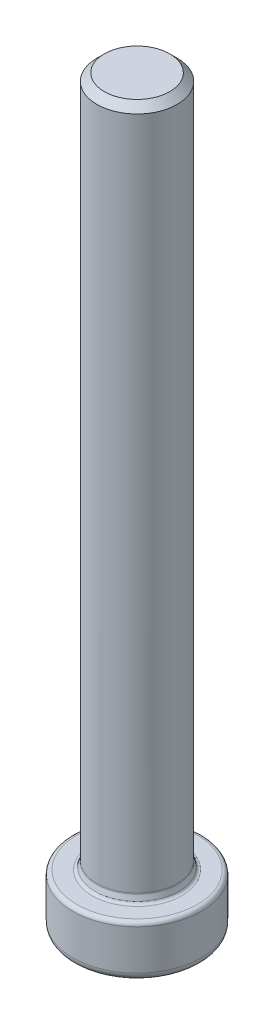
ISO-10303-21;
HEADER;
FILE_DESCRIPTION(('STEP AP214'),'2;1');
FILE_NAME('part.step','',(''),(''),'','','');
FILE_SCHEMA(('AUTOMOTIVE_DESIGN { 1 0 10303 214 1 1 1 1 }'));
ENDSEC;
DATA;
#1=APPLICATION_CONTEXT('core data for automotive mechanical design processes');
#2=APPLICATION_PROTOCOL_DEFINITION('international standard','automotive_design',2000,#1);
#3=PRODUCT_CONTEXT('',#1,'mechanical');
#4=PRODUCT('Part','Part','',(#3));
#5=PRODUCT_RELATED_PRODUCT_CATEGORY('part','',(#4));
#6=PRODUCT_DEFINITION_FORMATION('','',#4);
#7=PRODUCT_DEFINITION_CONTEXT('part definition',#1,'design');
#8=PRODUCT_DEFINITION('design','',#6,#7);
#9=PRODUCT_DEFINITION_SHAPE('','',#8);
#10=(LENGTH_UNIT() NAMED_UNIT(*) SI_UNIT(.MILLI.,.METRE.));
#11=(NAMED_UNIT(*) PLANE_ANGLE_UNIT() SI_UNIT($,.RADIAN.));
#12=(NAMED_UNIT(*) SI_UNIT($,.STERADIAN.) SOLID_ANGLE_UNIT());
#13=UNCERTAINTY_MEASURE_WITH_UNIT(LENGTH_MEASURE(1.E-05),#10,'distance_accuracy_value','');
#14=(GEOMETRIC_REPRESENTATION_CONTEXT(3) GLOBAL_UNCERTAINTY_ASSIGNED_CONTEXT((#13)) GLOBAL_UNIT_ASSIGNED_CONTEXT((#10,
#11,#12)) REPRESENTATION_CONTEXT('',''));
#15=CARTESIAN_POINT('',(0.,0.,0.));
#16=DIRECTION('',(0.,0.,1.));
#17=DIRECTION('',(1.,0.,0.));
#18=AXIS2_PLACEMENT_3D('',#15,#16,#17);
#19=CARTESIAN_POINT('',(-30.0499584026354,-27.5,11.));
#20=DIRECTION('',(0.,-1.,0.));
#21=DIRECTION('',(0.,0.,1.));
#22=AXIS2_PLACEMENT_3D('',#19,#20,#21);
#23=CYLINDRICAL_SURFACE('',#22,5.);
#24=CARTESIAN_POINT('',(-30.0499584026355,12.58,11.));
#25=DIRECTION('',(0.,-1.,0.));
#26=DIRECTION('',(0.,0.,1.));
#27=AXIS2_PLACEMENT_3D('',#24,#25,#26);
#28=CIRCLE('',#27,5.);
#29=CARTESIAN_POINT('',(-30.0499584026355,12.58,16.));
#30=VERTEX_POINT('',#29);
#31=CARTESIAN_POINT('',(-30.0499584026355,12.58,6.));
#32=VERTEX_POINT('',#31);
#33=EDGE_CURVE('E208',#30,#32,#28,.T.);
#34=ORIENTED_EDGE('',*,*,#33,.T.);
#35=DIRECTION('',(0.,-1.,0.));
#36=VECTOR('',#35,1.);
#37=CARTESIAN_POINT('',(-30.0499584026354,-27.5,6.));
#38=LINE('',#37,#36);
#39=CARTESIAN_POINT('',(-30.0499584026354,-71.48,6.));
#40=VERTEX_POINT('',#39);
#41=EDGE_CURVE('E11',#32,#40,#38,.T.);
#42=ORIENTED_EDGE('',*,*,#41,.T.);
#43=CARTESIAN_POINT('',(-30.0499584026354,-71.48,11.));
#44=DIRECTION('',(0.,1.,0.));
#45=DIRECTION('',(0.,0.,1.));
#46=AXIS2_PLACEMENT_3D('',#43,#44,#45);
#47=CIRCLE('',#46,5.);
#48=CARTESIAN_POINT('',(-25.0499584026354,-71.48,11.));
#49=VERTEX_POINT('',#48);
#50=EDGE_CURVE('E320',#40,#49,#47,.T.);
#51=ORIENTED_EDGE('',*,*,#50,.T.);
#52=CARTESIAN_POINT('',(-30.0499584026354,-71.48,11.));
#53=DIRECTION('',(0.,1.,0.));
#54=DIRECTION('',(0.,0.,1.));
#55=AXIS2_PLACEMENT_3D('',#52,#53,#54);
#56=CIRCLE('',#55,5.);
#57=EDGE_CURVE('E319',#49,#40,#56,.T.);
#58=ORIENTED_EDGE('',*,*,#57,.T.);
#59=ORIENTED_EDGE('',*,*,#41,.F.);
#60=CARTESIAN_POINT('',(-30.0499584026355,12.58,11.));
#61=DIRECTION('',(0.,-1.,0.));
#62=DIRECTION('',(0.,0.,1.));
#63=AXIS2_PLACEMENT_3D('',#60,#61,#62);
#64=CIRCLE('',#63,5.);
#65=EDGE_CURVE('E27',#32,#30,#64,.T.);
#66=ORIENTED_EDGE('',*,*,#65,.T.);
#67=EDGE_LOOP('',(#34,#42,#51,#58,#59,#66));
#68=FACE_BOUND('',#67,.T.);
#69=ADVANCED_FACE('F17',(#68),#23,.T.);
#70=CARTESIAN_POINT('',(-30.0499584026355,12.58,11.));
#71=DIRECTION('',(0.,-1.,0.));
#72=DIRECTION('',(0.,0.,-1.));
#73=AXIS2_PLACEMENT_3D('',#70,#71,#72);
#74=CONICAL_SURFACE('',#73,5.,0.78539816339745);
#75=ORIENTED_EDGE('',*,*,#33,.F.);
#76=DIRECTION('',(0.,0.707106781186546,-0.707106781186549));
#77=VECTOR('',#76,1.);
#78=CARTESIAN_POINT('',(-30.0499584026355,12.58,16.));
#79=LINE('',#78,#77);
#80=CARTESIAN_POINT('',(-30.0499584026355,13.5,15.08));
#81=VERTEX_POINT('',#80);
#82=EDGE_CURVE('E21',#30,#81,#79,.T.);
#83=ORIENTED_EDGE('',*,*,#82,.T.);
#84=CARTESIAN_POINT('',(-30.0499584026355,13.5,11.));
#85=DIRECTION('',(0.,-1.,0.));
#86=DIRECTION('',(0.,0.,1.));
#87=AXIS2_PLACEMENT_3D('',#84,#85,#86);
#88=CIRCLE('',#87,4.08);
#89=EDGE_CURVE('E185',#81,#81,#88,.T.);
#90=ORIENTED_EDGE('',*,*,#89,.T.);
#91=ORIENTED_EDGE('',*,*,#82,.F.);
#92=ORIENTED_EDGE('',*,*,#65,.F.);
#93=EDGE_LOOP('',(#75,#83,#90,#91,#92));
#94=FACE_BOUND('',#93,.T.);
#95=ADVANCED_FACE('F19',(#94),#74,.T.);
#96=CARTESIAN_POINT('',(-30.0499584026355,13.5,15.08));
#97=DIRECTION('',(0.,1.,0.));
#98=DIRECTION('',(1.,0.,0.));
#99=AXIS2_PLACEMENT_3D('',#96,#97,#98);
#100=PLANE('',#99);
#101=ORIENTED_EDGE('',*,*,#89,.F.);
#102=EDGE_LOOP('',(#101));
#103=FACE_BOUND('',#102,.T.);
#104=ADVANCED_FACE('F339',(#103),#100,.T.);
#105=CARTESIAN_POINT('',(-30.0499584026354,-72.1,11.));
#106=DIRECTION('',(0.,1.,0.));
#107=DIRECTION('',(-1.,0.,0.));
#108=AXIS2_PLACEMENT_3D('',#105,#106,#107);
#109=TOROIDAL_SURFACE('',#108,5.6,0.4);
#110=CARTESIAN_POINT('',(-30.0499584026354,-72.2228011119691,11.));
#111=DIRECTION('',(0.,-1.,0.));
#112=DIRECTION('',(-1.,0.,0.));
#113=AXIS2_PLACEMENT_3D('',#110,#111,#112);
#114=CIRCLE('',#113,5.21931655289578);
#115=CARTESIAN_POINT('',(-35.2692749555312,-72.2228011119691,11.));
#116=VERTEX_POINT('',#115);
#117=CARTESIAN_POINT('',(-24.8306418497397,-72.2228011119691,11.));
#118=VERTEX_POINT('',#117);
#119=EDGE_CURVE('E190',#116,#118,#114,.T.);
#120=ORIENTED_EDGE('',*,*,#119,.T.);
#121=CARTESIAN_POINT('',(-24.4499584026354,-72.1,11.));
#122=DIRECTION('',(0.,0.,1.));
#123=DIRECTION('',(1.,0.,0.));
#124=AXIS2_PLACEMENT_3D('',#121,#122,#123);
#125=CIRCLE('',#124,0.4);
#126=CARTESIAN_POINT('',(-24.4499584026354,-72.5,11.));
#127=VERTEX_POINT('',#126);
#128=EDGE_CURVE('E176',#118,#127,#125,.T.);
#129=ORIENTED_EDGE('',*,*,#128,.T.);
#130=CARTESIAN_POINT('',(-30.0499584026354,-72.5,11.));
#131=DIRECTION('',(0.,1.,0.));
#132=DIRECTION('',(0.,0.,-1.));
#133=AXIS2_PLACEMENT_3D('',#130,#131,#132);
#134=CIRCLE('',#133,5.6);
#135=EDGE_CURVE('E183',#127,#127,#134,.T.);
#136=ORIENTED_EDGE('',*,*,#135,.T.);
#137=ORIENTED_EDGE('',*,*,#128,.F.);
#138=CARTESIAN_POINT('',(-30.0499584026354,-72.2228011119691,11.));
#139=DIRECTION('',(0.,-1.,0.));
#140=DIRECTION('',(-1.,0.,0.));
#141=AXIS2_PLACEMENT_3D('',#138,#139,#140);
#142=CIRCLE('',#141,5.21931655289578);
#143=EDGE_CURVE('E180',#118,#116,#142,.T.);
#144=ORIENTED_EDGE('',*,*,#143,.T.);
#145=EDGE_LOOP('',(#120,#129,#136,#137,#144));
#146=FACE_BOUND('',#145,.T.);
#147=ADVANCED_FACE('F179',(#146),#109,.F.);
#148=CARTESIAN_POINT('',(-30.0499584026354,-71.6028011119691,11.));
#149=DIRECTION('',(0.,-1.,0.));
#150=DIRECTION('',(1.,0.,0.));
#151=AXIS2_PLACEMENT_3D('',#148,#149,#150);
#152=CONICAL_SURFACE('',#151,5.01931655289578,0.312042121562536);
#153=ORIENTED_EDGE('',*,*,#119,.F.);
#154=DIRECTION('',(0.307002779922761,0.95170861776055,0.));
#155=VECTOR('',#154,1.);
#156=CARTESIAN_POINT('',(-35.0692749555312,-71.6028011119691,11.));
#157=LINE('',#156,#155);
#158=CARTESIAN_POINT('',(-35.0692749555312,-71.6028011119691,11.));
#159=VERTEX_POINT('',#158);
#160=EDGE_CURVE('E192',#116,#159,#157,.T.);
#161=ORIENTED_EDGE('',*,*,#160,.T.);
#162=CARTESIAN_POINT('',(-30.0499584026354,-71.6028011119691,11.));
#163=DIRECTION('',(0.,-1.,0.));
#164=DIRECTION('',(-1.,0.,0.));
#165=AXIS2_PLACEMENT_3D('',#162,#163,#164);
#166=CIRCLE('',#165,5.01931655289578);
#167=CARTESIAN_POINT('',(-25.0306418497397,-71.6028011119691,11.));
#168=VERTEX_POINT('',#167);
#169=EDGE_CURVE('E202',#159,#168,#166,.T.);
#170=ORIENTED_EDGE('',*,*,#169,.T.);
#171=CARTESIAN_POINT('',(-30.0499584026354,-71.6028011119691,11.));
#172=DIRECTION('',(0.,-1.,0.));
#173=DIRECTION('',(-1.,0.,0.));
#174=AXIS2_PLACEMENT_3D('',#171,#172,#173);
#175=CIRCLE('',#174,5.01931655289578);
#176=EDGE_CURVE('E196',#168,#159,#175,.T.);
#177=ORIENTED_EDGE('',*,*,#176,.T.);
#178=ORIENTED_EDGE('',*,*,#160,.F.);
#179=ORIENTED_EDGE('',*,*,#143,.F.);
#180=EDGE_LOOP('',(#153,#161,#170,#177,#178,#179));
#181=FACE_BOUND('',#180,.T.);
#182=ADVANCED_FACE('F189',(#181),#152,.T.);
#183=CARTESIAN_POINT('',(-30.0499584026354,-71.48,11.));
#184=DIRECTION('',(0.,1.,0.));
#185=DIRECTION('',(-1.,0.,0.));
#186=AXIS2_PLACEMENT_3D('',#183,#184,#185);
#187=TOROIDAL_SURFACE('',#186,5.4,0.4);
#188=ORIENTED_EDGE('',*,*,#50,.F.);
#189=ORIENTED_EDGE('',*,*,#57,.F.);
#190=CARTESIAN_POINT('',(-24.6499584026354,-71.48,11.));
#191=DIRECTION('',(0.,0.,1.));
#192=DIRECTION('',(1.,0.,0.));
#193=AXIS2_PLACEMENT_3D('',#190,#191,#192);
#194=CIRCLE('',#193,0.4);
#195=EDGE_CURVE('E315',#49,#168,#194,.T.);
#196=ORIENTED_EDGE('',*,*,#195,.T.);
#197=ORIENTED_EDGE('',*,*,#169,.F.);
#198=ORIENTED_EDGE('',*,*,#176,.F.);
#199=ORIENTED_EDGE('',*,*,#195,.F.);
#200=EDGE_LOOP('',(#188,#189,#196,#197,#198,#199));
#201=FACE_BOUND('',#200,.T.);
#202=ADVANCED_FACE('F332',(#201),#187,.F.);
#203=CARTESIAN_POINT('',(-30.0499584026354,-75.5,11.));
#204=DIRECTION('',(0.,-1.,0.));
#205=DIRECTION('',(0.,0.,-1.));
#206=AXIS2_PLACEMENT_3D('',#203,#204,#205);
#207=CONICAL_SURFACE('',#206,4.,1.0471975511966);
#208=CARTESIAN_POINT('',(-30.0499584026354,-74.6339745962156,11.));
#209=DIRECTION('',(0.,-1.,0.));
#210=DIRECTION('',(0.,0.,1.));
#211=AXIS2_PLACEMENT_3D('',#208,#209,#210);
#212=CIRCLE('',#211,2.5);
#213=CARTESIAN_POINT('',(-30.0499584026354,-74.6339745962156,13.5));
#214=VERTEX_POINT('',#213);
#215=CARTESIAN_POINT('',(-30.0499584026354,-74.6339745962156,8.5));
#216=VERTEX_POINT('',#215);
#217=EDGE_CURVE('E303',#214,#216,#212,.T.);
#218=ORIENTED_EDGE('',*,*,#217,.F.);
#219=DIRECTION('',(0.,-0.5,0.86602540378444));
#220=VECTOR('',#219,1.);
#221=CARTESIAN_POINT('',(-30.0499584026354,-75.5,15.));
#222=LINE('',#221,#220);
#223=CARTESIAN_POINT('',(-30.0499584026354,-75.5,15.));
#224=VERTEX_POINT('',#223);
#225=EDGE_CURVE('E314',#214,#224,#222,.T.);
#226=ORIENTED_EDGE('',*,*,#225,.T.);
#227=CARTESIAN_POINT('',(-30.0499584026354,-75.5,11.));
#228=DIRECTION('',(0.,-1.,0.));
#229=DIRECTION('',(-1.,0.,0.));
#230=AXIS2_PLACEMENT_3D('',#227,#228,#229);
#231=CIRCLE('',#230,4.);
#232=CARTESIAN_POINT('',(-33.5140600177732,-75.5,13.));
#233=VERTEX_POINT('',#232);
#234=EDGE_CURVE('E278',#224,#233,#231,.T.);
#235=ORIENTED_EDGE('',*,*,#234,.T.);
#236=CARTESIAN_POINT('',(-30.0499584026354,-75.5,11.));
#237=DIRECTION('',(0.,-1.,0.));
#238=DIRECTION('',(-1.,0.,0.));
#239=AXIS2_PLACEMENT_3D('',#236,#237,#238);
#240=CIRCLE('',#239,4.);
#241=CARTESIAN_POINT('',(-33.5140600177732,-75.5,9.));
#242=VERTEX_POINT('',#241);
#243=EDGE_CURVE('E282',#233,#242,#240,.T.);
#244=ORIENTED_EDGE('',*,*,#243,.T.);
#245=CARTESIAN_POINT('',(-30.0499584026354,-75.5,11.));
#246=DIRECTION('',(0.,-1.,0.));
#247=DIRECTION('',(-1.,0.,0.));
#248=AXIS2_PLACEMENT_3D('',#245,#246,#247);
#249=CIRCLE('',#248,4.);
#250=CARTESIAN_POINT('',(-30.0499584026354,-75.5,7.));
#251=VERTEX_POINT('',#250);
#252=EDGE_CURVE('E286',#242,#251,#249,.T.);
#253=ORIENTED_EDGE('',*,*,#252,.T.);
#254=CARTESIAN_POINT('',(-30.0499584026354,-75.5,11.));
#255=DIRECTION('',(0.,-1.,0.));
#256=DIRECTION('',(-1.,0.,0.));
#257=AXIS2_PLACEMENT_3D('',#254,#255,#256);
#258=CIRCLE('',#257,4.);
#259=CARTESIAN_POINT('',(-26.5858567874977,-75.5,9.));
#260=VERTEX_POINT('',#259);
#261=EDGE_CURVE('E296',#251,#260,#258,.T.);
#262=ORIENTED_EDGE('',*,*,#261,.T.);
#263=CARTESIAN_POINT('',(-30.0499584026354,-75.5,11.));
#264=DIRECTION('',(0.,-1.,0.));
#265=DIRECTION('',(-1.,0.,0.));
#266=AXIS2_PLACEMENT_3D('',#263,#264,#265);
#267=CIRCLE('',#266,4.);
#268=CARTESIAN_POINT('',(-26.5858567874977,-75.5,13.));
#269=VERTEX_POINT('',#268);
#270=EDGE_CURVE('E292',#260,#269,#267,.T.);
#271=ORIENTED_EDGE('',*,*,#270,.T.);
#272=CARTESIAN_POINT('',(-30.0499584026354,-75.5,11.));
#273=DIRECTION('',(0.,-1.,0.));
#274=DIRECTION('',(-1.,0.,0.));
#275=AXIS2_PLACEMENT_3D('',#272,#273,#274);
#276=CIRCLE('',#275,4.);
#277=EDGE_CURVE('E287',#269,#224,#276,.T.);
#278=ORIENTED_EDGE('',*,*,#277,.T.);
#279=ORIENTED_EDGE('',*,*,#225,.F.);
#280=CARTESIAN_POINT('',(-30.0499584026354,-74.6339745962156,11.));
#281=DIRECTION('',(0.,-1.,0.));
#282=DIRECTION('',(0.,0.,1.));
#283=AXIS2_PLACEMENT_3D('',#280,#281,#282);
#284=CIRCLE('',#283,2.5);
#285=EDGE_CURVE('E307',#216,#214,#284,.T.);
#286=ORIENTED_EDGE('',*,*,#285,.F.);
#287=EDGE_LOOP('',(#218,#226,#235,#244,#253,#262,#271,#278,#279,#286));
#288=FACE_BOUND('',#287,.T.);
#289=ADVANCED_FACE('F372',(#288),#207,.F.);
#290=CARTESIAN_POINT('',(-30.0499584026354,-71.5,11.));
#291=DIRECTION('',(0.,-1.,0.));
#292=DIRECTION('',(0.,0.,1.));
#293=AXIS2_PLACEMENT_3D('',#290,#291,#292);
#294=CYLINDRICAL_SURFACE('',#293,2.5);
#295=ORIENTED_EDGE('',*,*,#217,.T.);
#296=DIRECTION('',(0.,1.,0.));
#297=VECTOR('',#296,1.);
#298=CARTESIAN_POINT('',(-30.0499584026354,-71.5,8.5));
#299=LINE('',#298,#297);
#300=CARTESIAN_POINT('',(-30.0499584026354,-71.5,8.5));
#301=VERTEX_POINT('',#300);
#302=EDGE_CURVE('E304',#216,#301,#299,.T.);
#303=ORIENTED_EDGE('',*,*,#302,.T.);
#304=CARTESIAN_POINT('',(-30.0499584026354,-71.5,11.));
#305=DIRECTION('',(0.,-1.,0.));
#306=DIRECTION('',(0.,0.,1.));
#307=AXIS2_PLACEMENT_3D('',#304,#305,#306);
#308=CIRCLE('',#307,2.5);
#309=EDGE_CURVE('E291',#301,#301,#308,.T.);
#310=ORIENTED_EDGE('',*,*,#309,.F.);
#311=ORIENTED_EDGE('',*,*,#302,.F.);
#312=ORIENTED_EDGE('',*,*,#285,.T.);
#313=EDGE_LOOP('',(#295,#303,#310,#311,#312));
#314=FACE_BOUND('',#313,.T.);
#315=ADVANCED_FACE('F368',(#314),#294,.F.);
#316=CARTESIAN_POINT('',(-32.5499584026354,-71.5,11.));
#317=DIRECTION('',(0.,1.,0.));
#318=DIRECTION('',(1.,0.,0.));
#319=AXIS2_PLACEMENT_3D('',#316,#317,#318);
#320=PLANE('',#319);
#321=ORIENTED_EDGE('',*,*,#309,.T.);
#322=EDGE_LOOP('',(#321));
#323=FACE_BOUND('',#322,.T.);
#324=ADVANCED_FACE('F371',(#323),#320,.F.);
#325=CARTESIAN_POINT('',(-30.0499584026354,-75.5,11.));
#326=DIRECTION('',(0.,-1.,0.));
#327=DIRECTION('',(0.,0.,-1.));
#328=AXIS2_PLACEMENT_3D('',#325,#326,#327);
#329=PLANE('',#328);
#330=ORIENTED_EDGE('',*,*,#277,.F.);
#331=DIRECTION('',(-0.5,0.,0.866025403784439));
#332=VECTOR('',#331,1.);
#333=CARTESIAN_POINT('',(-25.4311562491184,-75.5,11.));
#334=LINE('',#333,#332);
#335=CARTESIAN_POINT('',(-27.7405573258769,-75.5,15.));
#336=VERTEX_POINT('',#335);
#337=EDGE_CURVE('E247',#269,#336,#334,.T.);
#338=ORIENTED_EDGE('',*,*,#337,.T.);
#339=DIRECTION('',(-1.,0.,0.));
#340=VECTOR('',#339,1.);
#341=CARTESIAN_POINT('',(-27.7405573258769,-75.5,15.));
#342=LINE('',#341,#340);
#343=EDGE_CURVE('E266',#336,#224,#342,.T.);
#344=ORIENTED_EDGE('',*,*,#343,.T.);
#345=EDGE_LOOP('',(#330,#338,#344));
#346=FACE_BOUND('',#345,.T.);
#347=ADVANCED_FACE('F392',(#346),#329,.T.);
#348=CARTESIAN_POINT('',(-30.0499584026354,-75.5,11.));
#349=DIRECTION('',(0.,-1.,0.));
#350=DIRECTION('',(0.,0.,-1.));
#351=AXIS2_PLACEMENT_3D('',#348,#349,#350);
#352=PLANE('',#351);
#353=ORIENTED_EDGE('',*,*,#270,.F.);
#354=DIRECTION('',(0.5,0.,0.866025403784439));
#355=VECTOR('',#354,1.);
#356=CARTESIAN_POINT('',(-27.7405573258769,-75.5,7.));
#357=LINE('',#356,#355);
#358=CARTESIAN_POINT('',(-25.4311562491184,-75.5,11.));
#359=VERTEX_POINT('',#358);
#360=EDGE_CURVE('E239',#260,#359,#357,.T.);
#361=ORIENTED_EDGE('',*,*,#360,.T.);
#362=DIRECTION('',(-0.5,0.,0.866025403784439));
#363=VECTOR('',#362,1.);
#364=CARTESIAN_POINT('',(-25.4311562491184,-75.5,11.));
#365=LINE('',#364,#363);
#366=EDGE_CURVE('E251',#359,#269,#365,.T.);
#367=ORIENTED_EDGE('',*,*,#366,.T.);
#368=EDGE_LOOP('',(#353,#361,#367));
#369=FACE_BOUND('',#368,.T.);
#370=ADVANCED_FACE('F388',(#369),#352,.T.);
#371=CARTESIAN_POINT('',(-30.0499584026354,-75.5,11.));
#372=DIRECTION('',(0.,-1.,0.));
#373=DIRECTION('',(0.,0.,-1.));
#374=AXIS2_PLACEMENT_3D('',#371,#372,#373);
#375=PLANE('',#374);
#376=ORIENTED_EDGE('',*,*,#261,.F.);
#377=DIRECTION('',(1.,0.,0.));
#378=VECTOR('',#377,1.);
#379=CARTESIAN_POINT('',(-32.3593594793939,-75.5,7.));
#380=LINE('',#379,#378);
#381=CARTESIAN_POINT('',(-27.7405573258769,-75.5,7.));
#382=VERTEX_POINT('',#381);
#383=EDGE_CURVE('E231',#251,#382,#380,.T.);
#384=ORIENTED_EDGE('',*,*,#383,.T.);
#385=DIRECTION('',(0.5,0.,0.866025403784439));
#386=VECTOR('',#385,1.);
#387=CARTESIAN_POINT('',(-27.7405573258769,-75.5,7.));
#388=LINE('',#387,#386);
#389=EDGE_CURVE('E243',#382,#260,#388,.T.);
#390=ORIENTED_EDGE('',*,*,#389,.T.);
#391=EDGE_LOOP('',(#376,#384,#390));
#392=FACE_BOUND('',#391,.T.);
#393=ADVANCED_FACE('F384',(#392),#375,.T.);
#394=CARTESIAN_POINT('',(-30.0499584026354,-75.5,11.));
#395=DIRECTION('',(0.,-1.,0.));
#396=DIRECTION('',(0.,0.,-1.));
#397=AXIS2_PLACEMENT_3D('',#394,#395,#396);
#398=PLANE('',#397);
#399=ORIENTED_EDGE('',*,*,#252,.F.);
#400=DIRECTION('',(0.5,0.,-0.866025403784439));
#401=VECTOR('',#400,1.);
#402=CARTESIAN_POINT('',(-34.6687605561524,-75.5,11.));
#403=LINE('',#402,#401);
#404=CARTESIAN_POINT('',(-32.3593594793939,-75.5,7.));
#405=VERTEX_POINT('',#404);
#406=EDGE_CURVE('E256',#242,#405,#403,.T.);
#407=ORIENTED_EDGE('',*,*,#406,.T.);
#408=DIRECTION('',(1.,0.,0.));
#409=VECTOR('',#408,1.);
#410=CARTESIAN_POINT('',(-32.3593594793939,-75.5,7.));
#411=LINE('',#410,#409);
#412=EDGE_CURVE('E235',#405,#251,#411,.T.);
#413=ORIENTED_EDGE('',*,*,#412,.T.);
#414=EDGE_LOOP('',(#399,#407,#413));
#415=FACE_BOUND('',#414,.T.);
#416=ADVANCED_FACE('F380',(#415),#398,.T.);
#417=CARTESIAN_POINT('',(-30.0499584026354,-75.5,11.));
#418=DIRECTION('',(0.,-1.,0.));
#419=DIRECTION('',(0.,0.,-1.));
#420=AXIS2_PLACEMENT_3D('',#417,#418,#419);
#421=PLANE('',#420);
#422=DIRECTION('',(-0.5,0.,-0.866025403784439));
#423=VECTOR('',#422,1.);
#424=CARTESIAN_POINT('',(-32.3593594793939,-75.5,15.));
#425=LINE('',#424,#423);
#426=CARTESIAN_POINT('',(-34.6687605561524,-75.5,11.));
#427=VERTEX_POINT('',#426);
#428=EDGE_CURVE('E271',#233,#427,#425,.T.);
#429=ORIENTED_EDGE('',*,*,#428,.T.);
#430=DIRECTION('',(0.5,0.,-0.866025403784439));
#431=VECTOR('',#430,1.);
#432=CARTESIAN_POINT('',(-34.6687605561524,-75.5,11.));
#433=LINE('',#432,#431);
#434=EDGE_CURVE('E259',#427,#242,#433,.T.);
#435=ORIENTED_EDGE('',*,*,#434,.T.);
#436=ORIENTED_EDGE('',*,*,#243,.F.);
#437=EDGE_LOOP('',(#429,#435,#436));
#438=FACE_BOUND('',#437,.T.);
#439=ADVANCED_FACE('F376',(#438),#421,.T.);
#440=CARTESIAN_POINT('',(-30.0499584026354,-75.5,11.));
#441=DIRECTION('',(0.,-1.,0.));
#442=DIRECTION('',(0.,0.,-1.));
#443=AXIS2_PLACEMENT_3D('',#440,#441,#442);
#444=PLANE('',#443);
#445=ORIENTED_EDGE('',*,*,#234,.F.);
#446=DIRECTION('',(-1.,0.,0.));
#447=VECTOR('',#446,1.);
#448=CARTESIAN_POINT('',(-27.7405573258769,-75.5,15.));
#449=LINE('',#448,#447);
#450=CARTESIAN_POINT('',(-32.3593594793939,-75.5,15.));
#451=VERTEX_POINT('',#450);
#452=EDGE_CURVE('E263',#224,#451,#449,.T.);
#453=ORIENTED_EDGE('',*,*,#452,.T.);
#454=DIRECTION('',(-0.5,0.,-0.866025403784439));
#455=VECTOR('',#454,1.);
#456=CARTESIAN_POINT('',(-32.3593594793939,-75.5,15.));
#457=LINE('',#456,#455);
#458=EDGE_CURVE('E260',#451,#233,#457,.T.);
#459=ORIENTED_EDGE('',*,*,#458,.T.);
#460=EDGE_LOOP('',(#445,#453,#459));
#461=FACE_BOUND('',#460,.T.);
#462=ADVANCED_FACE('F366',(#461),#444,.T.);
#463=CARTESIAN_POINT('',(-34.6687605561524,-75.5,11.));
#464=DIRECTION('',(-0.866025403784439,0.,-0.5));
#465=DIRECTION('',(-0.5,0.,0.866025403784439));
#466=AXIS2_PLACEMENT_3D('',#463,#464,#465);
#467=PLANE('',#466);
#468=DIRECTION('',(0.,-1.,0.));
#469=VECTOR('',#468,1.);
#470=CARTESIAN_POINT('',(-34.6687605561524,-75.5,11.));
#471=LINE('',#470,#469);
#472=CARTESIAN_POINT('',(-34.6687605561524,-79.,11.));
#473=VERTEX_POINT('',#472);
#474=EDGE_CURVE('E268',#427,#473,#471,.T.);
#475=ORIENTED_EDGE('',*,*,#474,.T.);
#476=CARTESIAN_POINT('',(-34.6687605561524,-79.,11.));
#477=CARTESIAN_POINT('',(-33.5140600177732,-77.8452994616206,9.00000000000001));
#478=CARTESIAN_POINT('',(-32.3593594793939,-79.,7.));
#479=(BOUNDED_CURVE() B_SPLINE_CURVE(2,(#476,#477,#478),.UNSPECIFIED.,.F.,
.F.) B_SPLINE_CURVE_WITH_KNOTS((3,3),(-0.705094379751374,-0.147934530722328),
.UNSPECIFIED.) CURVE() GEOMETRIC_REPRESENTATION_ITEM() RATIONAL_B_SPLINE_CURVE((1.11602540378444,
1.28867513459481,1.11602540378444)) REPRESENTATION_ITEM(''));
#480=CARTESIAN_POINT('',(-32.3593594793939,-79.,7.));
#481=VERTEX_POINT('',#480);
#482=EDGE_CURVE('E722',#473,#481,#479,.T.);
#483=ORIENTED_EDGE('',*,*,#482,.T.);
#484=DIRECTION('',(0.,-1.,0.));
#485=VECTOR('',#484,1.);
#486=CARTESIAN_POINT('',(-32.3593594793939,-75.5,7.));
#487=LINE('',#486,#485);
#488=EDGE_CURVE('E227',#405,#481,#487,.T.);
#489=ORIENTED_EDGE('',*,*,#488,.F.);
#490=ORIENTED_EDGE('',*,*,#406,.F.);
#491=ORIENTED_EDGE('',*,*,#434,.F.);
#492=EDGE_LOOP('',(#475,#483,#489,#490,#491));
#493=FACE_BOUND('',#492,.T.);
#494=ADVANCED_FACE('F362',(#493),#467,.F.);
#495=CARTESIAN_POINT('',(-32.3593594793939,-75.5,15.));
#496=DIRECTION('',(-0.866025403784439,0.,0.5));
#497=DIRECTION('',(0.,1.,0.));
#498=AXIS2_PLACEMENT_3D('',#495,#496,#497);
#499=PLANE('',#498);
#500=DIRECTION('',(0.,-1.,0.));
#501=VECTOR('',#500,1.);
#502=CARTESIAN_POINT('',(-32.3593594793939,-75.5,15.));
#503=LINE('',#502,#501);
#504=CARTESIAN_POINT('',(-32.3593594793939,-79.,15.));
#505=VERTEX_POINT('',#504);
#506=EDGE_CURVE('E255',#451,#505,#503,.T.);
#507=ORIENTED_EDGE('',*,*,#506,.T.);
#508=CARTESIAN_POINT('',(-32.3593594793939,-79.,15.));
#509=CARTESIAN_POINT('',(-33.5140600177732,-77.8452994616206,13.));
#510=CARTESIAN_POINT('',(-34.6687605561524,-79.,11.));
#511=(BOUNDED_CURVE() B_SPLINE_CURVE(2,(#508,#509,#510),.UNSPECIFIED.,.F.,
.F.) B_SPLINE_CURVE_WITH_KNOTS((3,3),(-0.705094379751375,-0.147934530722328),
.UNSPECIFIED.) CURVE() GEOMETRIC_REPRESENTATION_ITEM() RATIONAL_B_SPLINE_CURVE((1.11602540378444,
1.28867513459482,1.11602540378444)) REPRESENTATION_ITEM(''));
#512=EDGE_CURVE('E709',#505,#473,#511,.T.);
#513=ORIENTED_EDGE('',*,*,#512,.T.);
#514=ORIENTED_EDGE('',*,*,#474,.F.);
#515=ORIENTED_EDGE('',*,*,#428,.F.);
#516=ORIENTED_EDGE('',*,*,#458,.F.);
#517=EDGE_LOOP('',(#507,#513,#514,#515,#516));
#518=FACE_BOUND('',#517,.T.);
#519=ADVANCED_FACE('F358',(#518),#499,.F.);
#520=CARTESIAN_POINT('',(-27.7405573258769,-75.5,15.));
#521=DIRECTION('',(0.,0.,1.));
#522=DIRECTION('',(1.,0.,0.));
#523=AXIS2_PLACEMENT_3D('',#520,#521,#522);
#524=PLANE('',#523);
#525=DIRECTION('',(0.,-1.,0.));
#526=VECTOR('',#525,1.);
#527=CARTESIAN_POINT('',(-27.7405573258769,-75.5,15.));
#528=LINE('',#527,#526);
#529=CARTESIAN_POINT('',(-27.7405573258769,-79.,15.));
#530=VERTEX_POINT('',#529);
#531=EDGE_CURVE('E244',#336,#530,#528,.T.);
#532=ORIENTED_EDGE('',*,*,#531,.T.);
#533=CARTESIAN_POINT('',(-27.7405573258769,-79.,15.));
#534=CARTESIAN_POINT('',(-30.0499584026354,-77.8452994616206,15.));
#535=CARTESIAN_POINT('',(-32.3593594793939,-79.,15.));
#536=(BOUNDED_CURVE() B_SPLINE_CURVE(2,(#533,#534,#535),.UNSPECIFIED.,.F.,
.F.) B_SPLINE_CURVE_WITH_KNOTS((3,3),(-0.705094379751374,-0.147934530722328),
.UNSPECIFIED.) CURVE() GEOMETRIC_REPRESENTATION_ITEM() RATIONAL_B_SPLINE_CURVE((1.11602540378444,
1.28867513459482,1.11602540378444)) REPRESENTATION_ITEM(''));
#537=EDGE_CURVE('E699',#530,#505,#536,.T.);
#538=ORIENTED_EDGE('',*,*,#537,.T.);
#539=ORIENTED_EDGE('',*,*,#506,.F.);
#540=ORIENTED_EDGE('',*,*,#452,.F.);
#541=ORIENTED_EDGE('',*,*,#343,.F.);
#542=EDGE_LOOP('',(#532,#538,#539,#540,#541));
#543=FACE_BOUND('',#542,.T.);
#544=ADVANCED_FACE('F361',(#543),#524,.F.);
#545=CARTESIAN_POINT('',(-25.4311562491184,-75.5,11.));
#546=DIRECTION('',(0.866025403784439,0.,0.5));
#547=DIRECTION('',(0.,-1.,0.));
#548=AXIS2_PLACEMENT_3D('',#545,#546,#547);
#549=PLANE('',#548);
#550=DIRECTION('',(0.,-1.,0.));
#551=VECTOR('',#550,1.);
#552=CARTESIAN_POINT('',(-25.4311562491184,-75.5,11.));
#553=LINE('',#552,#551);
#554=CARTESIAN_POINT('',(-25.4311562491184,-79.,11.));
#555=VERTEX_POINT('',#554);
#556=EDGE_CURVE('E236',#359,#555,#553,.T.);
#557=ORIENTED_EDGE('',*,*,#556,.T.);
#558=CARTESIAN_POINT('',(-25.4311562491184,-79.,11.));
#559=CARTESIAN_POINT('',(-26.5858567874977,-77.8452994616206,13.));
#560=CARTESIAN_POINT('',(-27.7405573258769,-79.,15.));
#561=(BOUNDED_CURVE() B_SPLINE_CURVE(2,(#558,#559,#560),.UNSPECIFIED.,.F.,
.F.) B_SPLINE_CURVE_WITH_KNOTS((3,3),(-0.705094379751373,-0.147934530722327),
.UNSPECIFIED.) CURVE() GEOMETRIC_REPRESENTATION_ITEM() RATIONAL_B_SPLINE_CURVE((1.11602540378444,
1.28867513459481,1.11602540378444)) REPRESENTATION_ITEM(''));
#562=EDGE_CURVE('E671',#555,#530,#561,.T.);
#563=ORIENTED_EDGE('',*,*,#562,.T.);
#564=ORIENTED_EDGE('',*,*,#531,.F.);
#565=ORIENTED_EDGE('',*,*,#337,.F.);
#566=ORIENTED_EDGE('',*,*,#366,.F.);
#567=EDGE_LOOP('',(#557,#563,#564,#565,#566));
#568=FACE_BOUND('',#567,.T.);
#569=ADVANCED_FACE('F356',(#568),#549,.F.);
#570=CARTESIAN_POINT('',(-27.7405573258769,-75.5,7.));
#571=DIRECTION('',(0.866025403784439,0.,-0.5));
#572=DIRECTION('',(0.,-1.,0.));
#573=AXIS2_PLACEMENT_3D('',#570,#571,#572);
#574=PLANE('',#573);
#575=DIRECTION('',(0.,-1.,0.));
#576=VECTOR('',#575,1.);
#577=CARTESIAN_POINT('',(-27.7405573258769,-75.5,7.));
#578=LINE('',#577,#576);
#579=CARTESIAN_POINT('',(-27.7405573258769,-79.,7.));
#580=VERTEX_POINT('',#579);
#581=EDGE_CURVE('E230',#382,#580,#578,.T.);
#582=ORIENTED_EDGE('',*,*,#581,.T.);
#583=CARTESIAN_POINT('',(-27.7405573258769,-79.,7.));
#584=CARTESIAN_POINT('',(-26.5858567874977,-77.8452994616206,9.));
#585=CARTESIAN_POINT('',(-25.4311562491184,-79.,11.));
#586=(BOUNDED_CURVE() B_SPLINE_CURVE(2,(#583,#584,#585),.UNSPECIFIED.,.F.,
.F.) B_SPLINE_CURVE_WITH_KNOTS((3,3),(-0.705094379751374,-0.147934530722328),
.UNSPECIFIED.) CURVE() GEOMETRIC_REPRESENTATION_ITEM() RATIONAL_B_SPLINE_CURVE((1.11602540378444,
1.28867513459482,1.11602540378444)) REPRESENTATION_ITEM(''));
#587=EDGE_CURVE('E666',#580,#555,#586,.T.);
#588=ORIENTED_EDGE('',*,*,#587,.T.);
#589=ORIENTED_EDGE('',*,*,#556,.F.);
#590=ORIENTED_EDGE('',*,*,#360,.F.);
#591=ORIENTED_EDGE('',*,*,#389,.F.);
#592=EDGE_LOOP('',(#582,#588,#589,#590,#591));
#593=FACE_BOUND('',#592,.T.);
#594=ADVANCED_FACE('F353',(#593),#574,.F.);
#595=CARTESIAN_POINT('',(-32.3593594793939,-75.5,7.));
#596=DIRECTION('',(0.,0.,-1.));
#597=DIRECTION('',(0.,-1.,0.));
#598=AXIS2_PLACEMENT_3D('',#595,#596,#597);
#599=PLANE('',#598);
#600=ORIENTED_EDGE('',*,*,#488,.T.);
#601=CARTESIAN_POINT('',(-32.359359479394,-79.,7.));
#602=CARTESIAN_POINT('',(-30.0499584026354,-77.8452994616206,7.));
#603=CARTESIAN_POINT('',(-27.7405573258769,-79.,7.));
#604=(BOUNDED_CURVE() B_SPLINE_CURVE(2,(#601,#602,#603),.UNSPECIFIED.,.F.,
.F.) B_SPLINE_CURVE_WITH_KNOTS((3,3),(-0.705094379751374,-0.147934530722328),
.UNSPECIFIED.) CURVE() GEOMETRIC_REPRESENTATION_ITEM() RATIONAL_B_SPLINE_CURVE((1.11602540378444,
1.28867513459481,1.11602540378444)) REPRESENTATION_ITEM(''));
#605=EDGE_CURVE('E769',#481,#580,#604,.T.);
#606=ORIENTED_EDGE('',*,*,#605,.T.);
#607=ORIENTED_EDGE('',*,*,#581,.F.);
#608=ORIENTED_EDGE('',*,*,#383,.F.);
#609=ORIENTED_EDGE('',*,*,#412,.F.);
#610=EDGE_LOOP('',(#600,#606,#607,#608,#609));
#611=FACE_BOUND('',#610,.T.);
#612=ADVANCED_FACE('F342',(#611),#599,.F.);
#613=CARTESIAN_POINT('',(-30.0499584026354,-79.,11.));
#614=DIRECTION('',(0.,-1.,0.));
#615=DIRECTION('',(0.,0.,-1.));
#616=AXIS2_PLACEMENT_3D('',#613,#614,#615);
#617=PLANE('',#616);
#618=CARTESIAN_POINT('',(-30.0499584026354,-79.,11.));
#619=DIRECTION('',(0.,1.,0.));
#620=DIRECTION('',(0.,0.,1.));
#621=AXIS2_PLACEMENT_3D('',#618,#619,#620);
#622=CIRCLE('',#621,4.61880215351701);
#623=EDGE_CURVE('E704',#473,#505,#622,.T.);
#624=ORIENTED_EDGE('',*,*,#623,.T.);
#625=CARTESIAN_POINT('',(-30.0499584026354,-79.,11.));
#626=DIRECTION('',(0.,1.,0.));
#627=DIRECTION('',(0.,0.,1.));
#628=AXIS2_PLACEMENT_3D('',#625,#626,#627);
#629=CIRCLE('',#628,4.61880215351701);
#630=EDGE_CURVE('E676',#505,#530,#629,.T.);
#631=ORIENTED_EDGE('',*,*,#630,.T.);
#632=CARTESIAN_POINT('',(-30.0499584026354,-79.,11.));
#633=DIRECTION('',(0.,-1.,0.));
#634=DIRECTION('',(-1.,0.,0.));
#635=AXIS2_PLACEMENT_3D('',#632,#633,#634);
#636=CIRCLE('',#635,4.61880215351701);
#637=EDGE_CURVE('E674',#555,#530,#636,.T.);
#638=ORIENTED_EDGE('',*,*,#637,.F.);
#639=CARTESIAN_POINT('',(-30.0499584026354,-79.,11.));
#640=DIRECTION('',(0.,-1.,0.));
#641=DIRECTION('',(-1.,0.,0.));
#642=AXIS2_PLACEMENT_3D('',#639,#640,#641);
#643=CIRCLE('',#642,4.61880215351701);
#644=EDGE_CURVE('E683',#580,#555,#643,.T.);
#645=ORIENTED_EDGE('',*,*,#644,.F.);
#646=CARTESIAN_POINT('',(-30.0499584026354,-79.,11.));
#647=DIRECTION('',(0.,-1.,0.));
#648=DIRECTION('',(-1.,0.,0.));
#649=AXIS2_PLACEMENT_3D('',#646,#647,#648);
#650=CIRCLE('',#649,4.61880215351701);
#651=EDGE_CURVE('E763',#481,#580,#650,.T.);
#652=ORIENTED_EDGE('',*,*,#651,.F.);
#653=CARTESIAN_POINT('',(-30.0499584026354,-79.,11.));
#654=DIRECTION('',(0.,-1.,0.));
#655=DIRECTION('',(-1.,0.,0.));
#656=AXIS2_PLACEMENT_3D('',#653,#654,#655);
#657=CIRCLE('',#656,4.61880215351701);
#658=EDGE_CURVE('E715',#473,#481,#657,.T.);
#659=ORIENTED_EDGE('',*,*,#658,.F.);
#660=EDGE_LOOP('',(#624,#631,#638,#645,#652,#659));
#661=FACE_BOUND('',#660,.T.);
#662=CARTESIAN_POINT('',(-30.0499584026354,-79.,11.));
#663=DIRECTION('',(0.,-1.,0.));
#664=DIRECTION('',(0.,0.,1.));
#665=AXIS2_PLACEMENT_3D('',#662,#663,#664);
#666=CIRCLE('',#665,7.);
#667=CARTESIAN_POINT('',(-30.0499584026354,-79.,4.));
#668=VERTEX_POINT('',#667);
#669=EDGE_CURVE('E225',#668,#668,#666,.T.);
#670=ORIENTED_EDGE('',*,*,#669,.T.);
#671=EDGE_LOOP('',(#670));
#672=FACE_BOUND('',#671,.T.);
#673=ADVANCED_FACE('F348',(#661,#672),#617,.T.);
#674=CARTESIAN_POINT('',(-30.0499584026354,-78.,11.));
#675=DIRECTION('',(0.,1.,0.));
#676=DIRECTION('',(0.,0.,1.));
#677=AXIS2_PLACEMENT_3D('',#674,#675,#676);
#678=TOROIDAL_SURFACE('',#677,7.,1.);
#679=CARTESIAN_POINT('',(-30.0499584026354,-78.,11.));
#680=DIRECTION('',(0.,1.,0.));
#681=DIRECTION('',(0.,0.,1.));
#682=AXIS2_PLACEMENT_3D('',#679,#680,#681);
#683=CIRCLE('',#682,8.);
#684=CARTESIAN_POINT('',(-30.0499584026354,-78.,3.));
#685=VERTEX_POINT('',#684);
#686=EDGE_CURVE('E745',#685,#685,#683,.T.);
#687=ORIENTED_EDGE('',*,*,#686,.F.);
#688=CARTESIAN_POINT('',(-30.0499584026354,-78.,4.));
#689=DIRECTION('',(-1.,0.,0.));
#690=DIRECTION('',(0.,0.,-1.));
#691=AXIS2_PLACEMENT_3D('',#688,#689,#690);
#692=CIRCLE('',#691,1.);
#693=EDGE_CURVE('E223',#685,#668,#692,.T.);
#694=ORIENTED_EDGE('',*,*,#693,.T.);
#695=ORIENTED_EDGE('',*,*,#669,.F.);
#696=ORIENTED_EDGE('',*,*,#693,.F.);
#697=EDGE_LOOP('',(#687,#694,#695,#696));
#698=FACE_BOUND('',#697,.T.);
#699=ADVANCED_FACE('F344',(#698),#678,.T.);
#700=CARTESIAN_POINT('',(-30.0499584026354,-27.5,11.));
#701=DIRECTION('',(0.,-1.,0.));
#702=DIRECTION('',(0.,0.,1.));
#703=AXIS2_PLACEMENT_3D('',#700,#701,#702);
#704=CYLINDRICAL_SURFACE('',#703,8.);
#705=CARTESIAN_POINT('',(-30.0499584026354,-73.,11.));
#706=DIRECTION('',(0.,-1.,0.));
#707=DIRECTION('',(0.,0.,1.));
#708=AXIS2_PLACEMENT_3D('',#705,#706,#707);
#709=CIRCLE('',#708,8.);
#710=CARTESIAN_POINT('',(-30.0499584026354,-73.,3.));
#711=VERTEX_POINT('',#710);
#712=EDGE_CURVE('E738',#711,#711,#709,.T.);
#713=ORIENTED_EDGE('',*,*,#712,.T.);
#714=DIRECTION('',(0.,-1.,0.));
#715=VECTOR('',#714,1.);
#716=CARTESIAN_POINT('',(-30.0499584026354,-27.5,3.));
#717=LINE('',#716,#715);
#718=EDGE_CURVE('E742',#711,#685,#717,.T.);
#719=ORIENTED_EDGE('',*,*,#718,.T.);
#720=ORIENTED_EDGE('',*,*,#686,.T.);
#721=ORIENTED_EDGE('',*,*,#718,.F.);
#722=EDGE_LOOP('',(#713,#719,#720,#721));
#723=FACE_BOUND('',#722,.T.);
#724=ADVANCED_FACE('F347',(#723),#704,.T.);
#725=CARTESIAN_POINT('',(-30.0499584026354,-73.,11.));
#726=DIRECTION('',(0.,1.,0.));
#727=DIRECTION('',(0.,0.,1.));
#728=AXIS2_PLACEMENT_3D('',#725,#726,#727);
#729=TOROIDAL_SURFACE('',#728,7.5,0.5);
#730=CARTESIAN_POINT('',(-30.0499584026354,-72.5,11.));
#731=DIRECTION('',(0.,-1.,0.));
#732=DIRECTION('',(0.,0.,1.));
#733=AXIS2_PLACEMENT_3D('',#730,#731,#732);
#734=CIRCLE('',#733,7.5);
#735=CARTESIAN_POINT('',(-30.0499584026354,-72.5,3.5));
#736=VERTEX_POINT('',#735);
#737=EDGE_CURVE('E728',#736,#736,#734,.T.);
#738=ORIENTED_EDGE('',*,*,#737,.T.);
#739=CARTESIAN_POINT('',(-30.0499584026354,-73.,3.5));
#740=DIRECTION('',(-1.,0.,0.));
#741=DIRECTION('',(0.,0.,-1.));
#742=AXIS2_PLACEMENT_3D('',#739,#740,#741);
#743=CIRCLE('',#742,0.5);
#744=EDGE_CURVE('E734',#736,#711,#743,.T.);
#745=ORIENTED_EDGE('',*,*,#744,.T.);
#746=ORIENTED_EDGE('',*,*,#712,.F.);
#747=ORIENTED_EDGE('',*,*,#744,.F.);
#748=EDGE_LOOP('',(#738,#745,#746,#747));
#749=FACE_BOUND('',#748,.T.);
#750=ADVANCED_FACE('F532',(#749),#729,.T.);
#751=CARTESIAN_POINT('',(-30.0499584026354,-72.5,19.));
#752=DIRECTION('',(0.,1.,0.));
#753=DIRECTION('',(1.,0.,0.));
#754=AXIS2_PLACEMENT_3D('',#751,#752,#753);
#755=PLANE('',#754);
#756=ORIENTED_EDGE('',*,*,#135,.F.);
#757=EDGE_LOOP('',(#756));
#758=FACE_BOUND('',#757,.T.);
#759=ORIENTED_EDGE('',*,*,#737,.F.);
#760=EDGE_LOOP('',(#759));
#761=FACE_BOUND('',#760,.T.);
#762=ADVANCED_FACE('F541',(#758,#761),#755,.T.);
#763=CARTESIAN_POINT('',(-30.0499584026354,-79.,11.));
#764=DIRECTION('',(0.,-1.,0.));
#765=DIRECTION('',(1.,0.,0.));
#766=AXIS2_PLACEMENT_3D('',#763,#764,#765);
#767=CONICAL_SURFACE('',#766,4.61880215351701,0.785398163397452);
#768=ORIENTED_EDGE('',*,*,#658,.T.);
#769=ORIENTED_EDGE('',*,*,#482,.F.);
#770=EDGE_LOOP('',(#768,#769));
#771=FACE_BOUND('',#770,.T.);
#772=ADVANCED_FACE('F550',(#771),#767,.F.);
#773=CARTESIAN_POINT('',(-30.0499584026354,-79.,11.));
#774=DIRECTION('',(0.,-1.,0.));
#775=DIRECTION('',(1.,0.,0.));
#776=AXIS2_PLACEMENT_3D('',#773,#774,#775);
#777=CONICAL_SURFACE('',#776,4.61880215351701,0.785398163397452);
#778=ORIENTED_EDGE('',*,*,#623,.F.);
#779=ORIENTED_EDGE('',*,*,#512,.F.);
#780=EDGE_LOOP('',(#778,#779));
#781=FACE_BOUND('',#780,.T.);
#782=ADVANCED_FACE('F559',(#781),#777,.F.);
#783=CARTESIAN_POINT('',(-30.0499584026354,-79.,11.));
#784=DIRECTION('',(0.,-1.,0.));
#785=DIRECTION('',(1.,0.,0.));
#786=AXIS2_PLACEMENT_3D('',#783,#784,#785);
#787=CONICAL_SURFACE('',#786,4.61880215351701,0.785398163397452);
#788=ORIENTED_EDGE('',*,*,#630,.F.);
#789=ORIENTED_EDGE('',*,*,#537,.F.);
#790=EDGE_LOOP('',(#788,#789));
#791=FACE_BOUND('',#790,.T.);
#792=ADVANCED_FACE('F568',(#791),#787,.F.);
#793=CARTESIAN_POINT('',(-30.0499584026354,-79.,11.));
#794=DIRECTION('',(0.,-1.,0.));
#795=DIRECTION('',(1.,0.,0.));
#796=AXIS2_PLACEMENT_3D('',#793,#794,#795);
#797=CONICAL_SURFACE('',#796,4.61880215351701,0.785398163397452);
#798=ORIENTED_EDGE('',*,*,#637,.T.);
#799=ORIENTED_EDGE('',*,*,#562,.F.);
#800=EDGE_LOOP('',(#798,#799));
#801=FACE_BOUND('',#800,.T.);
#802=ADVANCED_FACE('F577',(#801),#797,.F.);
#803=CARTESIAN_POINT('',(-30.0499584026354,-79.,11.));
#804=DIRECTION('',(0.,-1.,0.));
#805=DIRECTION('',(1.,0.,0.));
#806=AXIS2_PLACEMENT_3D('',#803,#804,#805);
#807=CONICAL_SURFACE('',#806,4.61880215351701,0.785398163397452);
#808=ORIENTED_EDGE('',*,*,#644,.T.);
#809=ORIENTED_EDGE('',*,*,#587,.F.);
#810=EDGE_LOOP('',(#808,#809));
#811=FACE_BOUND('',#810,.T.);
#812=ADVANCED_FACE('F586',(#811),#807,.F.);
#813=CARTESIAN_POINT('',(-30.0499584026354,-79.,11.));
#814=DIRECTION('',(0.,-1.,0.));
#815=DIRECTION('',(1.,0.,0.));
#816=AXIS2_PLACEMENT_3D('',#813,#814,#815);
#817=CONICAL_SURFACE('',#816,4.61880215351701,0.785398163397452);
#818=ORIENTED_EDGE('',*,*,#651,.T.);
#819=ORIENTED_EDGE('',*,*,#605,.F.);
#820=EDGE_LOOP('',(#818,#819));
#821=FACE_BOUND('',#820,.T.);
#822=ADVANCED_FACE('F595',(#821),#817,.F.);
#823=CLOSED_SHELL('',(#69,#95,#104,#147,#182,#202,#289,#315,#324,#347,#370,#393,#416,#439,#462,
#494,#519,#544,#569,#594,#612,#673,#699,#724,#750,#762,#772,#782,#792,#802,#812,#822));
#824=MANIFOLD_SOLID_BREP('B1',#823);
#825=ADVANCED_BREP_SHAPE_REPRESENTATION('',(#18,#824),#14);
#826=SHAPE_DEFINITION_REPRESENTATION(#9,#825);
ENDSEC;
END-ISO-10303-21;
